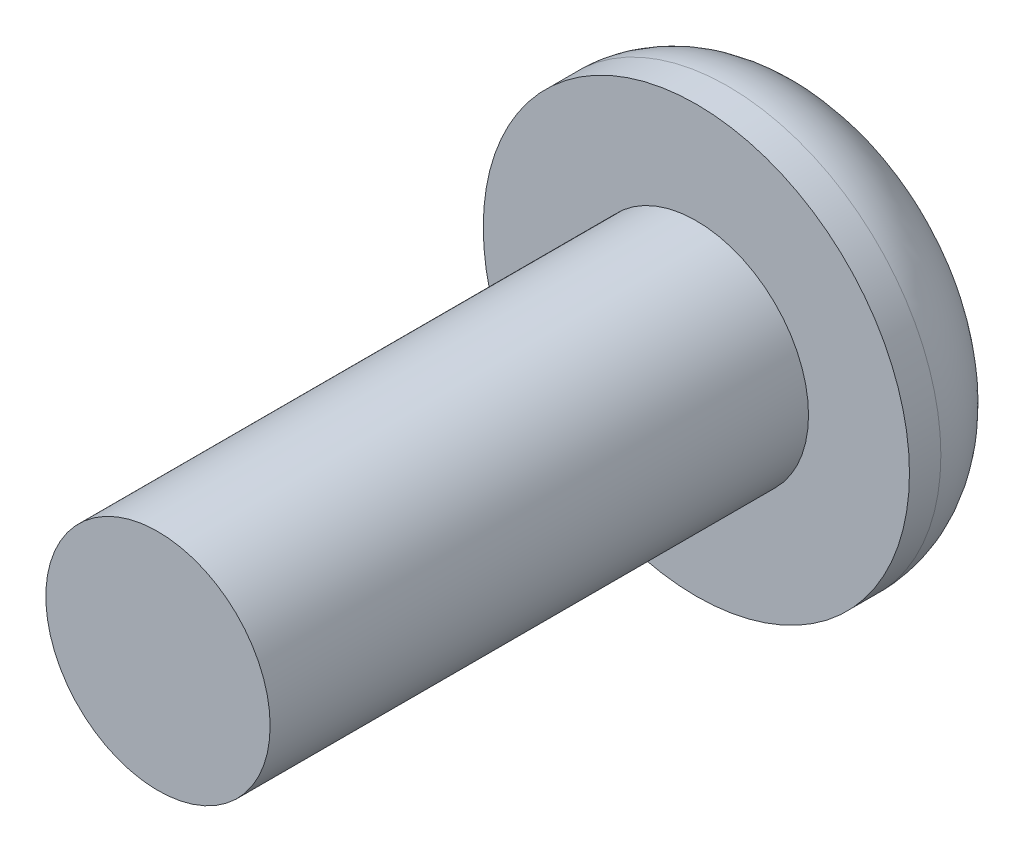
ISO-10303-21;
HEADER;
FILE_DESCRIPTION(('STEP AP214'),'2;1');
FILE_NAME('part.step','',(''),(''),'','','');
FILE_SCHEMA(('AUTOMOTIVE_DESIGN { 1 0 10303 214 1 1 1 1 }'));
ENDSEC;
DATA;
#1=APPLICATION_CONTEXT('core data for automotive mechanical design processes');
#2=APPLICATION_PROTOCOL_DEFINITION('international standard','automotive_design',2000,#1);
#3=PRODUCT_CONTEXT('',#1,'mechanical');
#4=PRODUCT('Part','Part','',(#3));
#5=PRODUCT_RELATED_PRODUCT_CATEGORY('part','',(#4));
#6=PRODUCT_DEFINITION_FORMATION('','',#4);
#7=PRODUCT_DEFINITION_CONTEXT('part definition',#1,'design');
#8=PRODUCT_DEFINITION('design','',#6,#7);
#9=PRODUCT_DEFINITION_SHAPE('','',#8);
#10=(LENGTH_UNIT() NAMED_UNIT(*) SI_UNIT(.MILLI.,.METRE.));
#11=(NAMED_UNIT(*) PLANE_ANGLE_UNIT() SI_UNIT($,.RADIAN.));
#12=(NAMED_UNIT(*) SI_UNIT($,.STERADIAN.) SOLID_ANGLE_UNIT());
#13=UNCERTAINTY_MEASURE_WITH_UNIT(LENGTH_MEASURE(1.E-05),#10,'distance_accuracy_value','');
#14=(GEOMETRIC_REPRESENTATION_CONTEXT(3) GLOBAL_UNCERTAINTY_ASSIGNED_CONTEXT((#13)) GLOBAL_UNIT_ASSIGNED_CONTEXT((#10,
#11,#12)) REPRESENTATION_CONTEXT('',''));
#15=CARTESIAN_POINT('',(0.,0.,0.));
#16=DIRECTION('',(0.,0.,1.));
#17=DIRECTION('',(1.,0.,0.));
#18=AXIS2_PLACEMENT_3D('',#15,#16,#17);
#19=CARTESIAN_POINT('',(0.,0.,12.));
#20=DIRECTION('',(0.,0.,-1.));
#21=DIRECTION('',(-1.,0.,0.));
#22=AXIS2_PLACEMENT_3D('',#19,#20,#21);
#23=CYLINDRICAL_SURFACE('',#22,2.5);
#24=CARTESIAN_POINT('',(0.,0.,12.));
#25=DIRECTION('',(0.,0.,1.));
#26=DIRECTION('',(1.,0.,0.));
#27=AXIS2_PLACEMENT_3D('',#24,#25,#26);
#28=CIRCLE('',#27,2.5);
#29=CARTESIAN_POINT('',(2.5,0.,12.));
#30=VERTEX_POINT('',#29);
#31=EDGE_CURVE('E168',#30,#30,#28,.T.);
#32=ORIENTED_EDGE('',*,*,#31,.F.);
#33=EDGE_LOOP('',(#32));
#34=FACE_BOUND('',#33,.T.);
#35=CARTESIAN_POINT('',(0.,0.,0.));
#36=DIRECTION('',(0.,0.,1.));
#37=DIRECTION('',(1.,0.,0.));
#38=AXIS2_PLACEMENT_3D('',#35,#36,#37);
#39=CIRCLE('',#38,2.5);
#40=CARTESIAN_POINT('',(2.5,0.,0.));
#41=VERTEX_POINT('',#40);
#42=EDGE_CURVE('E167',#41,#41,#39,.T.);
#43=ORIENTED_EDGE('',*,*,#42,.T.);
#44=EDGE_LOOP('',(#43));
#45=FACE_BOUND('',#44,.T.);
#46=ADVANCED_FACE('F39',(#34,#45),#23,.T.);
#47=CARTESIAN_POINT('',(0.,0.,12.));
#48=DIRECTION('',(0.,0.,1.));
#49=DIRECTION('',(1.,0.,0.));
#50=AXIS2_PLACEMENT_3D('',#47,#48,#49);
#51=PLANE('',#50);
#52=ORIENTED_EDGE('',*,*,#31,.T.);
#53=EDGE_LOOP('',(#52));
#54=FACE_BOUND('',#53,.T.);
#55=ADVANCED_FACE('F194',(#54),#51,.T.);
#56=CARTESIAN_POINT('',(0.,0.,-2.7));
#57=DIRECTION('',(0.,0.,1.));
#58=DIRECTION('',(1.,0.,0.));
#59=AXIS2_PLACEMENT_3D('',#56,#57,#58);
#60=CYLINDRICAL_SURFACE('',#59,4.75);
#61=CARTESIAN_POINT('',(0.,0.,-0.699999999999999));
#62=DIRECTION('',(0.,0.,-1.));
#63=DIRECTION('',(-1.,0.,0.));
#64=AXIS2_PLACEMENT_3D('',#61,#62,#63);
#65=CIRCLE('',#64,4.75);
#66=CARTESIAN_POINT('',(4.75,0.,-0.699999999999999));
#67=VERTEX_POINT('',#66);
#68=EDGE_CURVE('E11',#67,#67,#65,.F.);
#69=CARTESIAN_POINT('',(0.,0.,0.));
#70=DIRECTION('',(0.,0.,-1.));
#71=DIRECTION('',(-1.,0.,0.));
#72=AXIS2_PLACEMENT_3D('',#69,#70,#71);
#73=CIRCLE('',#72,4.75);
#74=CARTESIAN_POINT('',(4.75,0.,0.));
#75=VERTEX_POINT('',#74);
#76=EDGE_CURVE('E154',#75,#75,#73,.T.);
#77=CARTESIAN_POINT('',(4.75,0.,-0.699999999999999));
#78=CARTESIAN_POINT('',(4.75,0.,-0.692708333333332));
#79=CARTESIAN_POINT('',(4.75,0.,-0.685416666666665));
#80=CARTESIAN_POINT('',(4.75,0.,-0.670833333333332));
#81=CARTESIAN_POINT('',(4.75,0.,-0.663541666666665));
#82=CARTESIAN_POINT('',(4.75,0.,-0.648958333333332));
#83=CARTESIAN_POINT('',(4.75,0.,-0.641666666666666));
#84=CARTESIAN_POINT('',(4.75,0.,-0.627083333333332));
#85=CARTESIAN_POINT('',(4.75,0.,-0.619791666666666));
#86=CARTESIAN_POINT('',(4.75,0.,-0.605208333333332));
#87=CARTESIAN_POINT('',(4.75,0.,-0.597916666666665));
#88=CARTESIAN_POINT('',(4.75,0.,-0.583333333333332));
#89=CARTESIAN_POINT('',(4.75,0.,-0.576041666666666));
#90=CARTESIAN_POINT('',(4.75,0.,-0.561458333333332));
#91=CARTESIAN_POINT('',(4.75,0.,-0.554166666666666));
#92=CARTESIAN_POINT('',(4.75,0.,-0.539583333333332));
#93=CARTESIAN_POINT('',(4.75,0.,-0.532291666666666));
#94=CARTESIAN_POINT('',(4.75,0.,-0.517708333333332));
#95=CARTESIAN_POINT('',(4.75,0.,-0.510416666666666));
#96=CARTESIAN_POINT('',(4.75,0.,-0.495833333333332));
#97=CARTESIAN_POINT('',(4.75,0.,-0.488541666666666));
#98=CARTESIAN_POINT('',(4.75,0.,-0.473958333333332));
#99=CARTESIAN_POINT('',(4.75,0.,-0.466666666666666));
#100=CARTESIAN_POINT('',(4.75,0.,-0.452083333333333));
#101=CARTESIAN_POINT('',(4.75,0.,-0.444791666666666));
#102=CARTESIAN_POINT('',(4.75,0.,-0.430208333333332));
#103=CARTESIAN_POINT('',(4.75,0.,-0.422916666666666));
#104=CARTESIAN_POINT('',(4.75,0.,-0.408333333333332));
#105=CARTESIAN_POINT('',(4.75,0.,-0.401041666666666));
#106=CARTESIAN_POINT('',(4.75,0.,-0.386458333333333));
#107=CARTESIAN_POINT('',(4.75,0.,-0.379166666666666));
#108=CARTESIAN_POINT('',(4.75,0.,-0.364583333333333));
#109=CARTESIAN_POINT('',(4.75,0.,-0.357291666666666));
#110=CARTESIAN_POINT('',(4.75,0.,-0.342708333333332));
#111=CARTESIAN_POINT('',(4.75,0.,-0.335416666666666));
#112=CARTESIAN_POINT('',(4.75,0.,-0.320833333333332));
#113=CARTESIAN_POINT('',(4.75,0.,-0.313541666666666));
#114=CARTESIAN_POINT('',(4.75,0.,-0.298958333333333));
#115=CARTESIAN_POINT('',(4.75,0.,-0.291666666666666));
#116=CARTESIAN_POINT('',(4.75,0.,-0.277083333333333));
#117=CARTESIAN_POINT('',(4.75,0.,-0.269791666666666));
#118=CARTESIAN_POINT('',(4.75,0.,-0.255208333333333));
#119=CARTESIAN_POINT('',(4.75,0.,-0.247916666666666));
#120=CARTESIAN_POINT('',(4.75,0.,-0.233333333333333));
#121=CARTESIAN_POINT('',(4.75,0.,-0.226041666666666));
#122=CARTESIAN_POINT('',(4.75,0.,-0.211458333333333));
#123=CARTESIAN_POINT('',(4.75,0.,-0.204166666666666));
#124=CARTESIAN_POINT('',(4.75,0.,-0.189583333333333));
#125=CARTESIAN_POINT('',(4.75,0.,-0.182291666666666));
#126=CARTESIAN_POINT('',(4.75,0.,-0.167708333333333));
#127=CARTESIAN_POINT('',(4.75,0.,-0.160416666666666));
#128=CARTESIAN_POINT('',(4.75,0.,-0.145833333333333));
#129=CARTESIAN_POINT('',(4.75,0.,-0.138541666666666));
#130=CARTESIAN_POINT('',(4.75,0.,-0.123958333333333));
#131=CARTESIAN_POINT('',(4.75,0.,-0.116666666666666));
#132=CARTESIAN_POINT('',(4.75,0.,-0.102083333333333));
#133=CARTESIAN_POINT('',(4.75,0.,-0.0947916666666662));
#134=CARTESIAN_POINT('',(4.75,0.,-0.0802083333333327));
#135=CARTESIAN_POINT('',(4.75,0.,-0.072916666666666));
#136=CARTESIAN_POINT('',(4.75,0.,-0.0583333333333327));
#137=CARTESIAN_POINT('',(4.75,0.,-0.0510416666666661));
#138=CARTESIAN_POINT('',(4.75,0.,-0.0364583333333329));
#139=CARTESIAN_POINT('',(4.75,0.,-0.0291666666666664));
#140=CARTESIAN_POINT('',(4.75,0.,-0.014583333333333));
#141=CARTESIAN_POINT('',(4.75,0.,-0.00729166666666628));
#142=CARTESIAN_POINT('',(4.75,0.,0.));
#143=B_SPLINE_CURVE_WITH_KNOTS('',3,(#77,#78,#79,#80,#81,#82,#83,#84,#85,#86,#87,#88,#89,#90,
#91,#92,#93,#94,#95,#96,#97,#98,#99,#100,#101,#102,#103,#104,#105,#106,#107,#108,#109,#110,#111,
#112,#113,#114,#115,#116,#117,#118,#119,#120,#121,#122,#123,#124,#125,#126,#127,#128,#129,#130,
#131,#132,#133,#134,#135,#136,#137,#138,#139,#140,#141,#142),.UNSPECIFIED.,.F.,.F.,(4,2,2,2,2,2,
2,2,2,2,2,2,2,2,2,2,2,2,2,2,2,2,2,2,2,2,2,2,2,2,2,2,4),(0.,0.0218750000000002,0.04375,
0.0656249999999997,0.0874999999999999,0.109375,0.13125,0.153125,0.175,0.196875,0.21875,0.240625,
0.2625,0.284375,0.30625,0.328124999999999,0.35,0.371875,0.39375,0.415624999999999,0.4375,
0.459375,0.481249999999999,0.503124999999999,0.524999999999999,0.546875,0.568749999999999,
0.590624999999999,0.612499999999999,0.634374999999999,0.656249999999999,0.678124999999999,
0.699999999999999),.UNSPECIFIED.);
#144=EDGE_CURVE('BSEAM199',#67,#75,#143,.T.);
#145=ORIENTED_EDGE('',*,*,#68,.T.);
#146=ORIENTED_EDGE('',*,*,#76,.T.);
#147=ORIENTED_EDGE('',*,*,#144,.T.);
#148=ORIENTED_EDGE('',*,*,#144,.F.);
#149=EDGE_LOOP('',(#145,#147,#146,#148));
#150=FACE_BOUND('',#149,.T.);
#151=ADVANCED_FACE('F199',(#150),#60,.T.);
#152=CARTESIAN_POINT('',(0.,0.,-2.7));
#153=DIRECTION('',(0.,0.,-1.));
#154=DIRECTION('',(-1.,0.,0.));
#155=AXIS2_PLACEMENT_3D('',#152,#153,#154);
#156=PLANE('',#155);
#157=DIRECTION('',(0.0352025068557176,0.999380199679318,0.));
#158=VECTOR('',#157,1.);
#159=CARTESIAN_POINT('',(-1.52955656473292,-0.812684880677878,-2.7));
#160=LINE('',#159,#158);
#161=CARTESIAN_POINT('',(-1.52955656473292,-0.812684880677878,-2.7));
#162=VERTEX_POINT('',#161);
#163=CARTESIAN_POINT('',(-1.46858403430503,0.91829240124503,-2.7));
#164=VERTEX_POINT('',#163);
#165=EDGE_CURVE('E55',#162,#164,#160,.T.);
#166=ORIENTED_EDGE('',*,*,#165,.F.);
#167=DIRECTION('',(-0.847887387533595,0.530176365053606,0.));
#168=VECTOR('',#167,1.);
#169=CARTESIAN_POINT('',(-0.0609725304278944,-1.73097728192291,-2.7));
#170=LINE('',#169,#168);
#171=CARTESIAN_POINT('',(-0.0609725304278944,-1.73097728192291,-2.7));
#172=VERTEX_POINT('',#171);
#173=EDGE_CURVE('E148',#172,#162,#170,.T.);
#174=ORIENTED_EDGE('',*,*,#173,.F.);
#175=DIRECTION('',(-0.883089894389313,-0.469203834625712,0.));
#176=VECTOR('',#175,1.);
#177=CARTESIAN_POINT('',(1.46858403430503,-0.918292401245031,-2.7));
#178=LINE('',#177,#176);
#179=CARTESIAN_POINT('',(1.46858403430503,-0.918292401245031,-2.7));
#180=VERTEX_POINT('',#179);
#181=EDGE_CURVE('E145',#180,#172,#178,.T.);
#182=ORIENTED_EDGE('',*,*,#181,.F.);
#183=DIRECTION('',(-0.0352025068557176,-0.999380199679318,0.));
#184=VECTOR('',#183,1.);
#185=CARTESIAN_POINT('',(1.52955656473292,0.812684880677878,-2.7));
#186=LINE('',#185,#184);
#187=CARTESIAN_POINT('',(1.52955656473292,0.812684880677878,-2.7));
#188=VERTEX_POINT('',#187);
#189=EDGE_CURVE('E103',#188,#180,#186,.T.);
#190=ORIENTED_EDGE('',*,*,#189,.F.);
#191=DIRECTION('',(0.847887387533595,-0.530176365053606,0.));
#192=VECTOR('',#191,1.);
#193=CARTESIAN_POINT('',(0.0609725304278946,1.73097728192291,-2.7));
#194=LINE('',#193,#192);
#195=CARTESIAN_POINT('',(0.0609725304278946,1.73097728192291,-2.7));
#196=VERTEX_POINT('',#195);
#197=EDGE_CURVE('E139',#196,#188,#194,.T.);
#198=ORIENTED_EDGE('',*,*,#197,.F.);
#199=DIRECTION('',(0.883089894389313,0.469203834625712,0.));
#200=VECTOR('',#199,1.);
#201=CARTESIAN_POINT('',(-1.46858403430503,0.91829240124503,-2.7));
#202=LINE('',#201,#200);
#203=EDGE_CURVE('E135',#164,#196,#202,.T.);
#204=ORIENTED_EDGE('',*,*,#203,.F.);
#205=EDGE_LOOP('',(#166,#174,#182,#190,#198,#204));
#206=FACE_BOUND('',#205,.T.);
#207=CARTESIAN_POINT('',(0.,0.,-2.7));
#208=DIRECTION('',(0.,0.,-1.));
#209=DIRECTION('',(-1.,0.,0.));
#210=AXIS2_PLACEMENT_3D('',#207,#208,#209);
#211=CIRCLE('',#210,2.75);
#212=CARTESIAN_POINT('',(-2.75,0.,-2.7));
#213=VERTEX_POINT('',#212);
#214=EDGE_CURVE('E48',#213,#213,#211,.T.);
#215=ORIENTED_EDGE('',*,*,#214,.T.);
#216=EDGE_LOOP('',(#215));
#217=FACE_BOUND('',#216,.T.);
#218=ADVANCED_FACE('F178',(#206,#217),#156,.T.);
#219=CARTESIAN_POINT('',(0.,0.,0.));
#220=DIRECTION('',(0.,0.,-1.));
#221=DIRECTION('',(-1.,0.,0.));
#222=AXIS2_PLACEMENT_3D('',#219,#220,#221);
#223=PLANE('',#222);
#224=ORIENTED_EDGE('',*,*,#42,.F.);
#225=EDGE_LOOP('',(#224));
#226=FACE_BOUND('',#225,.T.);
#227=ORIENTED_EDGE('',*,*,#76,.F.);
#228=EDGE_LOOP('',(#227));
#229=FACE_BOUND('',#228,.T.);
#230=ADVANCED_FACE('F182',(#226,#229),#223,.F.);
#231=CARTESIAN_POINT('',(0.,0.,-0.7));
#232=DIRECTION('',(0.,0.,-1.));
#233=DIRECTION('',(-1.,0.,0.));
#234=AXIS2_PLACEMENT_3D('',#231,#232,#233);
#235=TOROIDAL_SURFACE('',#234,2.75,2.);
#236=ORIENTED_EDGE('',*,*,#68,.F.);
#237=EDGE_LOOP('',(#236));
#238=FACE_BOUND('',#237,.T.);
#239=ORIENTED_EDGE('',*,*,#214,.F.);
#240=EDGE_LOOP('',(#239));
#241=FACE_BOUND('',#240,.T.);
#242=ADVANCED_FACE('F41',(#238,#241),#235,.T.);
#243=CARTESIAN_POINT('',(-1.52955656473292,-0.812684880677878,-1.14));
#244=DIRECTION('',(-0.999380199679318,0.0352025068557176,0.));
#245=DIRECTION('',(-0.0352025068557176,-0.999380199679318,0.));
#246=AXIS2_PLACEMENT_3D('',#243,#244,#245);
#247=PLANE('',#246);
#248=ORIENTED_EDGE('',*,*,#165,.T.);
#249=DIRECTION('',(0.,0.,-1.));
#250=VECTOR('',#249,1.);
#251=CARTESIAN_POINT('',(-1.46858403430503,0.91829240124503,-1.14));
#252=LINE('',#251,#250);
#253=CARTESIAN_POINT('',(-1.46858403430503,0.91829240124503,-1.14));
#254=VERTEX_POINT('',#253);
#255=EDGE_CURVE('E85',#254,#164,#252,.T.);
#256=ORIENTED_EDGE('',*,*,#255,.F.);
#257=DIRECTION('',(0.0352025068557176,0.999380199679318,0.));
#258=VECTOR('',#257,1.);
#259=CARTESIAN_POINT('',(-1.52955656473292,-0.812684880677878,-1.14));
#260=LINE('',#259,#258);
#261=CARTESIAN_POINT('',(-1.52955656473292,-0.812684880677878,-1.14));
#262=VERTEX_POINT('',#261);
#263=EDGE_CURVE('E151',#262,#254,#260,.T.);
#264=ORIENTED_EDGE('',*,*,#263,.F.);
#265=DIRECTION('',(0.,0.,-1.));
#266=VECTOR('',#265,1.);
#267=CARTESIAN_POINT('',(-1.52955656473292,-0.812684880677878,-1.14));
#268=LINE('',#267,#266);
#269=EDGE_CURVE('E63',#262,#162,#268,.T.);
#270=ORIENTED_EDGE('',*,*,#269,.T.);
#271=EDGE_LOOP('',(#248,#256,#264,#270));
#272=FACE_BOUND('',#271,.T.);
#273=ADVANCED_FACE('F181',(#272),#247,.F.);
#274=CARTESIAN_POINT('',(-0.0609725304278944,-1.73097728192291,-1.14));
#275=DIRECTION('',(-0.530176365053606,-0.847887387533595,0.));
#276=DIRECTION('',(0.847887387533595,-0.530176365053606,0.));
#277=AXIS2_PLACEMENT_3D('',#274,#275,#276);
#278=PLANE('',#277);
#279=ORIENTED_EDGE('',*,*,#173,.T.);
#280=ORIENTED_EDGE('',*,*,#269,.F.);
#281=DIRECTION('',(-0.847887387533595,0.530176365053606,0.));
#282=VECTOR('',#281,1.);
#283=CARTESIAN_POINT('',(-0.0609725304278944,-1.73097728192291,-1.14));
#284=LINE('',#283,#282);
#285=CARTESIAN_POINT('',(-0.0609725304278944,-1.73097728192291,-1.14));
#286=VERTEX_POINT('',#285);
#287=EDGE_CURVE('E117',#286,#262,#284,.T.);
#288=ORIENTED_EDGE('',*,*,#287,.F.);
#289=DIRECTION('',(0.,0.,-1.));
#290=VECTOR('',#289,1.);
#291=CARTESIAN_POINT('',(-0.0609725304278944,-1.73097728192291,-1.14));
#292=LINE('',#291,#290);
#293=EDGE_CURVE('E108',#286,#172,#292,.T.);
#294=ORIENTED_EDGE('',*,*,#293,.T.);
#295=EDGE_LOOP('',(#279,#280,#288,#294));
#296=FACE_BOUND('',#295,.T.);
#297=ADVANCED_FACE('F188',(#296),#278,.F.);
#298=CARTESIAN_POINT('',(1.46858403430503,-0.918292401245031,-1.14));
#299=DIRECTION('',(0.469203834625712,-0.883089894389313,0.));
#300=DIRECTION('',(0.883089894389313,0.469203834625712,0.));
#301=AXIS2_PLACEMENT_3D('',#298,#299,#300);
#302=PLANE('',#301);
#303=ORIENTED_EDGE('',*,*,#181,.T.);
#304=ORIENTED_EDGE('',*,*,#293,.F.);
#305=DIRECTION('',(-0.883089894389313,-0.469203834625712,0.));
#306=VECTOR('',#305,1.);
#307=CARTESIAN_POINT('',(1.46858403430503,-0.918292401245031,-1.14));
#308=LINE('',#307,#306);
#309=CARTESIAN_POINT('',(1.46858403430503,-0.918292401245031,-1.14));
#310=VERTEX_POINT('',#309);
#311=EDGE_CURVE('E112',#310,#286,#308,.T.);
#312=ORIENTED_EDGE('',*,*,#311,.F.);
#313=DIRECTION('',(0.,0.,-1.));
#314=VECTOR('',#313,1.);
#315=CARTESIAN_POINT('',(1.46858403430503,-0.918292401245031,-1.14));
#316=LINE('',#315,#314);
#317=EDGE_CURVE('E96',#310,#180,#316,.T.);
#318=ORIENTED_EDGE('',*,*,#317,.T.);
#319=EDGE_LOOP('',(#303,#304,#312,#318));
#320=FACE_BOUND('',#319,.T.);
#321=ADVANCED_FACE('F113',(#320),#302,.F.);
#322=CARTESIAN_POINT('',(1.52955656473292,0.812684880677878,-1.14));
#323=DIRECTION('',(0.999380199679318,-0.0352025068557176,0.));
#324=DIRECTION('',(0.0352025068557176,0.999380199679318,0.));
#325=AXIS2_PLACEMENT_3D('',#322,#323,#324);
#326=PLANE('',#325);
#327=ORIENTED_EDGE('',*,*,#189,.T.);
#328=ORIENTED_EDGE('',*,*,#317,.F.);
#329=DIRECTION('',(-0.0352025068557176,-0.999380199679318,0.));
#330=VECTOR('',#329,1.);
#331=CARTESIAN_POINT('',(1.52955656473292,0.812684880677878,-1.14));
#332=LINE('',#331,#330);
#333=CARTESIAN_POINT('',(1.52955656473292,0.812684880677878,-1.14));
#334=VERTEX_POINT('',#333);
#335=EDGE_CURVE('E100',#334,#310,#332,.T.);
#336=ORIENTED_EDGE('',*,*,#335,.F.);
#337=DIRECTION('',(0.,0.,-1.));
#338=VECTOR('',#337,1.);
#339=CARTESIAN_POINT('',(1.52955656473292,0.812684880677878,-1.14));
#340=LINE('',#339,#338);
#341=EDGE_CURVE('E109',#334,#188,#340,.T.);
#342=ORIENTED_EDGE('',*,*,#341,.T.);
#343=EDGE_LOOP('',(#327,#328,#336,#342));
#344=FACE_BOUND('',#343,.T.);
#345=ADVANCED_FACE('F98',(#344),#326,.F.);
#346=CARTESIAN_POINT('',(0.0609725304278946,1.73097728192291,-1.14));
#347=DIRECTION('',(0.530176365053606,0.847887387533595,0.));
#348=DIRECTION('',(-0.847887387533595,0.530176365053606,0.));
#349=AXIS2_PLACEMENT_3D('',#346,#347,#348);
#350=PLANE('',#349);
#351=ORIENTED_EDGE('',*,*,#197,.T.);
#352=ORIENTED_EDGE('',*,*,#341,.F.);
#353=DIRECTION('',(0.847887387533595,-0.530176365053606,0.));
#354=VECTOR('',#353,1.);
#355=CARTESIAN_POINT('',(0.0609725304278946,1.73097728192291,-1.14));
#356=LINE('',#355,#354);
#357=CARTESIAN_POINT('',(0.0609725304278946,1.73097728192291,-1.14));
#358=VERTEX_POINT('',#357);
#359=EDGE_CURVE('E123',#358,#334,#356,.T.);
#360=ORIENTED_EDGE('',*,*,#359,.F.);
#361=DIRECTION('',(0.,0.,-1.));
#362=VECTOR('',#361,1.);
#363=CARTESIAN_POINT('',(0.0609725304278946,1.73097728192291,-1.14));
#364=LINE('',#363,#362);
#365=EDGE_CURVE('E159',#358,#196,#364,.T.);
#366=ORIENTED_EDGE('',*,*,#365,.T.);
#367=EDGE_LOOP('',(#351,#352,#360,#366));
#368=FACE_BOUND('',#367,.T.);
#369=ADVANCED_FACE('F214',(#368),#350,.F.);
#370=CARTESIAN_POINT('',(-1.46858403430503,0.91829240124503,-1.14));
#371=DIRECTION('',(-0.469203834625712,0.883089894389313,0.));
#372=DIRECTION('',(-0.883089894389313,-0.469203834625712,0.));
#373=AXIS2_PLACEMENT_3D('',#370,#371,#372);
#374=PLANE('',#373);
#375=ORIENTED_EDGE('',*,*,#203,.T.);
#376=ORIENTED_EDGE('',*,*,#365,.F.);
#377=DIRECTION('',(0.883089894389313,0.469203834625712,0.));
#378=VECTOR('',#377,1.);
#379=CARTESIAN_POINT('',(-1.46858403430503,0.91829240124503,-1.14));
#380=LINE('',#379,#378);
#381=EDGE_CURVE('E127',#254,#358,#380,.T.);
#382=ORIENTED_EDGE('',*,*,#381,.F.);
#383=ORIENTED_EDGE('',*,*,#255,.T.);
#384=EDGE_LOOP('',(#375,#376,#382,#383));
#385=FACE_BOUND('',#384,.T.);
#386=ADVANCED_FACE('F211',(#385),#374,.F.);
#387=CARTESIAN_POINT('',(0.,0.,-1.14));
#388=DIRECTION('',(0.,0.,-1.));
#389=DIRECTION('',(-1.,0.,0.));
#390=AXIS2_PLACEMENT_3D('',#387,#388,#389);
#391=PLANE('',#390);
#392=ORIENTED_EDGE('',*,*,#263,.T.);
#393=ORIENTED_EDGE('',*,*,#381,.T.);
#394=ORIENTED_EDGE('',*,*,#359,.T.);
#395=ORIENTED_EDGE('',*,*,#335,.T.);
#396=ORIENTED_EDGE('',*,*,#311,.T.);
#397=ORIENTED_EDGE('',*,*,#287,.T.);
#398=EDGE_LOOP('',(#392,#393,#394,#395,#396,#397));
#399=FACE_BOUND('',#398,.T.);
#400=ADVANCED_FACE('F120',(#399),#391,.T.);
#401=CLOSED_SHELL('',(#46,#55,#151,#218,#230,#242,#273,#297,#321,#345,#369,#386,#400));
#402=MANIFOLD_SOLID_BREP('B2',#401);
#403=ADVANCED_BREP_SHAPE_REPRESENTATION('',(#18,#402),#14);
#404=SHAPE_DEFINITION_REPRESENTATION(#9,#403);
ENDSEC;
END-ISO-10303-21;
